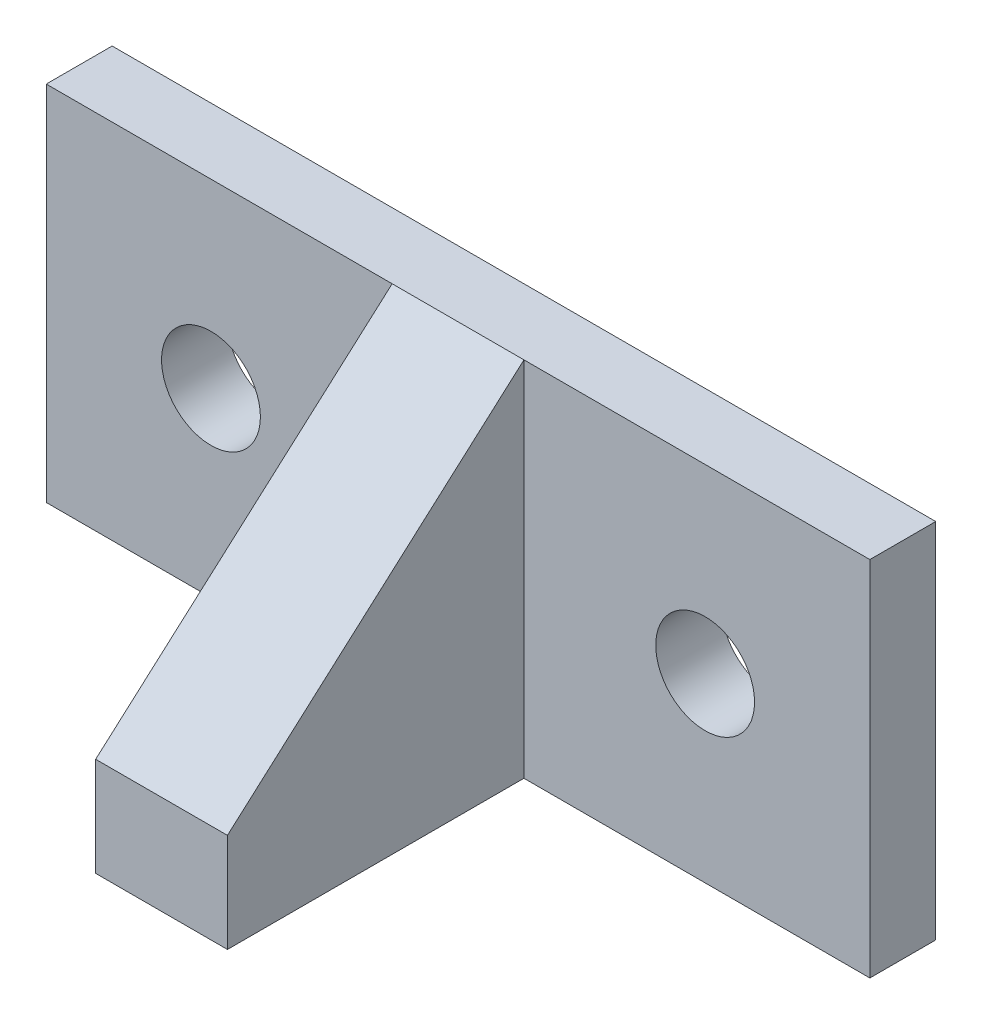
ISO-10303-21;
HEADER;
FILE_DESCRIPTION(('STEP AP214'),'2;1');
FILE_NAME('part.step','',(''),(''),'','','');
FILE_SCHEMA(('AUTOMOTIVE_DESIGN { 1 0 10303 214 1 1 1 1 }'));
ENDSEC;
DATA;
#1=APPLICATION_CONTEXT('core data for automotive mechanical design processes');
#2=APPLICATION_PROTOCOL_DEFINITION('international standard','automotive_design',2000,#1);
#3=PRODUCT_CONTEXT('',#1,'mechanical');
#4=PRODUCT('Part','Part','',(#3));
#5=PRODUCT_RELATED_PRODUCT_CATEGORY('part','',(#4));
#6=PRODUCT_DEFINITION_FORMATION('','',#4);
#7=PRODUCT_DEFINITION_CONTEXT('part definition',#1,'design');
#8=PRODUCT_DEFINITION('design','',#6,#7);
#9=PRODUCT_DEFINITION_SHAPE('','',#8);
#10=(LENGTH_UNIT() NAMED_UNIT(*) SI_UNIT(.MILLI.,.METRE.));
#11=(NAMED_UNIT(*) PLANE_ANGLE_UNIT() SI_UNIT($,.RADIAN.));
#12=(NAMED_UNIT(*) SI_UNIT($,.STERADIAN.) SOLID_ANGLE_UNIT());
#13=UNCERTAINTY_MEASURE_WITH_UNIT(LENGTH_MEASURE(1.E-05),#10,'distance_accuracy_value','');
#14=(GEOMETRIC_REPRESENTATION_CONTEXT(3) GLOBAL_UNCERTAINTY_ASSIGNED_CONTEXT((#13)) GLOBAL_UNIT_ASSIGNED_CONTEXT((#10,
#11,#12)) REPRESENTATION_CONTEXT('',''));
#15=CARTESIAN_POINT('',(0.,0.,0.));
#16=DIRECTION('',(0.,0.,1.));
#17=DIRECTION('',(1.,0.,0.));
#18=AXIS2_PLACEMENT_3D('',#15,#16,#17);
#19=CARTESIAN_POINT('',(-62.5,27.5,10.));
#20=DIRECTION('',(0.,-1.,0.));
#21=DIRECTION('',(0.,0.,-1.));
#22=AXIS2_PLACEMENT_3D('',#19,#20,#21);
#23=PLANE('',#22);
#24=DIRECTION('',(1.,0.,0.));
#25=VECTOR('',#24,1.);
#26=CARTESIAN_POINT('',(-35.,27.5,10.));
#27=LINE('',#26,#25);
#28=CARTESIAN_POINT('',(-10.,27.5,10.));
#29=VERTEX_POINT('',#28);
#30=CARTESIAN_POINT('',(9.99999999999999,27.5,10.));
#31=VERTEX_POINT('',#30);
#32=EDGE_CURVE('E111',#29,#31,#27,.T.);
#33=ORIENTED_EDGE('',*,*,#32,.T.);
#34=DIRECTION('',(-1.,0.,0.));
#35=VECTOR('',#34,1.);
#36=CARTESIAN_POINT('',(-62.5,27.5,10.));
#37=LINE('',#36,#35);
#38=CARTESIAN_POINT('',(62.5,27.5,10.));
#39=VERTEX_POINT('',#38);
#40=EDGE_CURVE('E120',#39,#31,#37,.T.);
#41=ORIENTED_EDGE('',*,*,#40,.F.);
#42=DIRECTION('',(0.,0.,-1.));
#43=VECTOR('',#42,1.);
#44=CARTESIAN_POINT('',(62.5,27.5,10.));
#45=LINE('',#44,#43);
#46=CARTESIAN_POINT('',(62.5,27.5,0.));
#47=VERTEX_POINT('',#46);
#48=EDGE_CURVE('E53',#39,#47,#45,.T.);
#49=ORIENTED_EDGE('',*,*,#48,.T.);
#50=DIRECTION('',(-1.,0.,0.));
#51=VECTOR('',#50,1.);
#52=CARTESIAN_POINT('',(-62.5,27.5,0.));
#53=LINE('',#52,#51);
#54=CARTESIAN_POINT('',(-62.5,27.5,0.));
#55=VERTEX_POINT('',#54);
#56=EDGE_CURVE('E187',#47,#55,#53,.T.);
#57=ORIENTED_EDGE('',*,*,#56,.T.);
#58=DIRECTION('',(0.,0.,-1.));
#59=VECTOR('',#58,1.);
#60=CARTESIAN_POINT('',(-62.5,27.5,10.));
#61=LINE('',#60,#59);
#62=CARTESIAN_POINT('',(-62.5,27.5,10.));
#63=VERTEX_POINT('',#62);
#64=EDGE_CURVE('E202',#63,#55,#61,.T.);
#65=ORIENTED_EDGE('',*,*,#64,.F.);
#66=EDGE_CURVE('E123',#29,#63,#37,.T.);
#67=ORIENTED_EDGE('',*,*,#66,.F.);
#68=EDGE_LOOP('',(#33,#41,#49,#57,#65,#67));
#69=FACE_BOUND('',#68,.T.);
#70=ADVANCED_FACE('F44',(#69),#23,.F.);
#71=CARTESIAN_POINT('',(9.99999999999999,27.5,55.));
#72=DIRECTION('',(-1.,0.,0.));
#73=DIRECTION('',(0.,-1.,0.));
#74=AXIS2_PLACEMENT_3D('',#71,#72,#73);
#75=PLANE('',#74);
#76=DIRECTION('',(0.,-0.66436383882992,0.74740931868366));
#77=VECTOR('',#76,1.);
#78=CARTESIAN_POINT('',(10.,20.3275862068966,18.0689655172414));
#79=LINE('',#78,#77);
#80=CARTESIAN_POINT('',(10.,-12.5,55.));
#81=VERTEX_POINT('',#80);
#82=EDGE_CURVE('E108',#31,#81,#79,.T.);
#83=ORIENTED_EDGE('',*,*,#82,.T.);
#84=DIRECTION('',(0.,1.,0.));
#85=VECTOR('',#84,1.);
#86=CARTESIAN_POINT('',(9.99999999999999,27.5,55.));
#87=LINE('',#86,#85);
#88=CARTESIAN_POINT('',(10.,-27.5,55.));
#89=VERTEX_POINT('',#88);
#90=EDGE_CURVE('E144',#89,#81,#87,.T.);
#91=ORIENTED_EDGE('',*,*,#90,.F.);
#92=DIRECTION('',(0.,0.,-1.));
#93=VECTOR('',#92,1.);
#94=CARTESIAN_POINT('',(10.,-27.5,55.));
#95=LINE('',#94,#93);
#96=CARTESIAN_POINT('',(9.99999999999999,-27.5,10.));
#97=VERTEX_POINT('',#96);
#98=EDGE_CURVE('E137',#89,#97,#95,.T.);
#99=ORIENTED_EDGE('',*,*,#98,.T.);
#100=DIRECTION('',(0.,1.,0.));
#101=VECTOR('',#100,1.);
#102=CARTESIAN_POINT('',(9.99999999999999,27.5,10.));
#103=LINE('',#102,#101);
#104=EDGE_CURVE('E67',#97,#31,#103,.T.);
#105=ORIENTED_EDGE('',*,*,#104,.T.);
#106=EDGE_LOOP('',(#83,#91,#99,#105));
#107=FACE_BOUND('',#106,.T.);
#108=ADVANCED_FACE('F135',(#107),#75,.F.);
#109=CARTESIAN_POINT('',(-10.,27.5,55.));
#110=DIRECTION('',(1.,0.,0.));
#111=DIRECTION('',(0.,1.,0.));
#112=AXIS2_PLACEMENT_3D('',#109,#110,#111);
#113=PLANE('',#112);
#114=DIRECTION('',(0.,-0.66436383882992,0.74740931868366));
#115=VECTOR('',#114,1.);
#116=CARTESIAN_POINT('',(-10.,5.1551724137931,35.1379310344828));
#117=LINE('',#116,#115);
#118=CARTESIAN_POINT('',(-10.,-12.5,55.));
#119=VERTEX_POINT('',#118);
#120=EDGE_CURVE('E60',#29,#119,#117,.T.);
#121=ORIENTED_EDGE('',*,*,#120,.F.);
#122=DIRECTION('',(0.,-1.,0.));
#123=VECTOR('',#122,1.);
#124=CARTESIAN_POINT('',(-10.,27.5,10.));
#125=LINE('',#124,#123);
#126=CARTESIAN_POINT('',(-9.99999999999999,-27.5,10.));
#127=VERTEX_POINT('',#126);
#128=EDGE_CURVE('E139',#29,#127,#125,.T.);
#129=ORIENTED_EDGE('',*,*,#128,.T.);
#130=DIRECTION('',(0.,0.,-1.));
#131=VECTOR('',#130,1.);
#132=CARTESIAN_POINT('',(-9.99999999999999,-27.5,55.));
#133=LINE('',#132,#131);
#134=CARTESIAN_POINT('',(-9.99999999999999,-27.5,55.));
#135=VERTEX_POINT('',#134);
#136=EDGE_CURVE('E153',#135,#127,#133,.T.);
#137=ORIENTED_EDGE('',*,*,#136,.F.);
#138=DIRECTION('',(0.,-1.,0.));
#139=VECTOR('',#138,1.);
#140=CARTESIAN_POINT('',(-10.,27.5,55.));
#141=LINE('',#140,#139);
#142=EDGE_CURVE('E230',#119,#135,#141,.T.);
#143=ORIENTED_EDGE('',*,*,#142,.F.);
#144=EDGE_LOOP('',(#121,#129,#137,#143));
#145=FACE_BOUND('',#144,.T.);
#146=ADVANCED_FACE('F228',(#145),#113,.F.);
#147=CARTESIAN_POINT('',(0.,0.,55.));
#148=DIRECTION('',(0.,0.,1.));
#149=DIRECTION('',(1.,0.,0.));
#150=AXIS2_PLACEMENT_3D('',#147,#148,#149);
#151=PLANE('',#150);
#152=ORIENTED_EDGE('',*,*,#90,.T.);
#153=DIRECTION('',(-1.,0.,0.));
#154=VECTOR('',#153,1.);
#155=CARTESIAN_POINT('',(0.,-12.5,55.));
#156=LINE('',#155,#154);
#157=EDGE_CURVE('E12',#81,#119,#156,.T.);
#158=ORIENTED_EDGE('',*,*,#157,.T.);
#159=ORIENTED_EDGE('',*,*,#142,.T.);
#160=DIRECTION('',(1.,0.,0.));
#161=VECTOR('',#160,1.);
#162=CARTESIAN_POINT('',(-9.99999999999999,-27.5,55.));
#163=LINE('',#162,#161);
#164=EDGE_CURVE('E148',#135,#89,#163,.T.);
#165=ORIENTED_EDGE('',*,*,#164,.T.);
#166=EDGE_LOOP('',(#152,#158,#159,#165));
#167=FACE_BOUND('',#166,.T.);
#168=ADVANCED_FACE('F236',(#167),#151,.T.);
#169=CARTESIAN_POINT('',(0.,0.,10.));
#170=DIRECTION('',(0.,0.,1.));
#171=DIRECTION('',(1.,0.,0.));
#172=AXIS2_PLACEMENT_3D('',#169,#170,#171);
#173=PLANE('',#172);
#174=ORIENTED_EDGE('',*,*,#104,.F.);
#175=DIRECTION('',(1.,0.,0.));
#176=VECTOR('',#175,1.);
#177=CARTESIAN_POINT('',(-62.5,-27.5,10.));
#178=LINE('',#177,#176);
#179=CARTESIAN_POINT('',(62.5,-27.5,10.));
#180=VERTEX_POINT('',#179);
#181=EDGE_CURVE('E179',#97,#180,#178,.T.);
#182=ORIENTED_EDGE('',*,*,#181,.T.);
#183=DIRECTION('',(0.,1.,0.));
#184=VECTOR('',#183,1.);
#185=CARTESIAN_POINT('',(62.5,27.5,10.));
#186=LINE('',#185,#184);
#187=EDGE_CURVE('E129',#180,#39,#186,.T.);
#188=ORIENTED_EDGE('',*,*,#187,.T.);
#189=ORIENTED_EDGE('',*,*,#40,.T.);
#190=EDGE_LOOP('',(#174,#182,#188,#189));
#191=FACE_BOUND('',#190,.T.);
#192=CARTESIAN_POINT('',(37.5,0.,10.));
#193=DIRECTION('',(0.,0.,1.));
#194=DIRECTION('',(1.,0.,0.));
#195=AXIS2_PLACEMENT_3D('',#192,#193,#194);
#196=CIRCLE('',#195,7.5);
#197=CARTESIAN_POINT('',(45.,0.,10.));
#198=VERTEX_POINT('',#197);
#199=EDGE_CURVE('E158',#198,#198,#196,.T.);
#200=ORIENTED_EDGE('',*,*,#199,.F.);
#201=EDGE_LOOP('',(#200));
#202=FACE_BOUND('',#201,.T.);
#203=ADVANCED_FACE('F126',(#191,#202),#173,.T.);
#204=ORIENTED_EDGE('',*,*,#128,.F.);
#205=ORIENTED_EDGE('',*,*,#66,.T.);
#206=DIRECTION('',(0.,-1.,0.));
#207=VECTOR('',#206,1.);
#208=CARTESIAN_POINT('',(-62.5,27.5,10.));
#209=LINE('',#208,#207);
#210=CARTESIAN_POINT('',(-62.5,-27.5,10.));
#211=VERTEX_POINT('',#210);
#212=EDGE_CURVE('E132',#63,#211,#209,.T.);
#213=ORIENTED_EDGE('',*,*,#212,.T.);
#214=EDGE_CURVE('E180',#211,#127,#178,.T.);
#215=ORIENTED_EDGE('',*,*,#214,.T.);
#216=EDGE_LOOP('',(#204,#205,#213,#215));
#217=FACE_BOUND('',#216,.T.);
#218=CARTESIAN_POINT('',(-37.5,0.,10.));
#219=DIRECTION('',(0.,0.,1.));
#220=DIRECTION('',(1.,0.,0.));
#221=AXIS2_PLACEMENT_3D('',#218,#219,#220);
#222=CIRCLE('',#221,7.5);
#223=CARTESIAN_POINT('',(-30.,0.,10.));
#224=VERTEX_POINT('',#223);
#225=EDGE_CURVE('E166',#224,#224,#222,.T.);
#226=ORIENTED_EDGE('',*,*,#225,.F.);
#227=EDGE_LOOP('',(#226));
#228=FACE_BOUND('',#227,.T.);
#229=ADVANCED_FACE('F225',(#217,#228),#173,.T.);
#230=CARTESIAN_POINT('',(0.,0.,0.));
#231=DIRECTION('',(0.,0.,1.));
#232=DIRECTION('',(1.,0.,0.));
#233=AXIS2_PLACEMENT_3D('',#230,#231,#232);
#234=PLANE('',#233);
#235=DIRECTION('',(0.,1.,0.));
#236=VECTOR('',#235,1.);
#237=CARTESIAN_POINT('',(62.5,27.5,0.));
#238=LINE('',#237,#236);
#239=CARTESIAN_POINT('',(62.5,-27.5,0.));
#240=VERTEX_POINT('',#239);
#241=EDGE_CURVE('E170',#240,#47,#238,.T.);
#242=ORIENTED_EDGE('',*,*,#241,.F.);
#243=DIRECTION('',(1.,0.,0.));
#244=VECTOR('',#243,1.);
#245=CARTESIAN_POINT('',(-62.5,-27.5,0.));
#246=LINE('',#245,#244);
#247=CARTESIAN_POINT('',(-62.5,-27.5,0.));
#248=VERTEX_POINT('',#247);
#249=EDGE_CURVE('E175',#248,#240,#246,.T.);
#250=ORIENTED_EDGE('',*,*,#249,.F.);
#251=DIRECTION('',(0.,-1.,0.));
#252=VECTOR('',#251,1.);
#253=CARTESIAN_POINT('',(-62.5,27.5,0.));
#254=LINE('',#253,#252);
#255=EDGE_CURVE('E190',#55,#248,#254,.T.);
#256=ORIENTED_EDGE('',*,*,#255,.F.);
#257=ORIENTED_EDGE('',*,*,#56,.F.);
#258=EDGE_LOOP('',(#242,#250,#256,#257));
#259=FACE_BOUND('',#258,.T.);
#260=CARTESIAN_POINT('',(-37.5,0.,0.));
#261=DIRECTION('',(0.,0.,1.));
#262=DIRECTION('',(1.,0.,0.));
#263=AXIS2_PLACEMENT_3D('',#260,#261,#262);
#264=CIRCLE('',#263,7.5);
#265=CARTESIAN_POINT('',(-30.,0.,0.));
#266=VERTEX_POINT('',#265);
#267=EDGE_CURVE('E162',#266,#266,#264,.T.);
#268=ORIENTED_EDGE('',*,*,#267,.T.);
#269=EDGE_LOOP('',(#268));
#270=FACE_BOUND('',#269,.T.);
#271=CARTESIAN_POINT('',(37.5,0.,0.));
#272=DIRECTION('',(0.,0.,1.));
#273=DIRECTION('',(1.,0.,0.));
#274=AXIS2_PLACEMENT_3D('',#271,#272,#273);
#275=CIRCLE('',#274,7.5);
#276=CARTESIAN_POINT('',(45.,0.,0.));
#277=VERTEX_POINT('',#276);
#278=EDGE_CURVE('E157',#277,#277,#275,.T.);
#279=ORIENTED_EDGE('',*,*,#278,.T.);
#280=EDGE_LOOP('',(#279));
#281=FACE_BOUND('',#280,.T.);
#282=ADVANCED_FACE('F211',(#259,#270,#281),#234,.F.);
#283=CARTESIAN_POINT('',(62.5,27.5,10.));
#284=DIRECTION('',(-1.,0.,0.));
#285=DIRECTION('',(0.,0.,1.));
#286=AXIS2_PLACEMENT_3D('',#283,#284,#285);
#287=PLANE('',#286);
#288=ORIENTED_EDGE('',*,*,#241,.T.);
#289=ORIENTED_EDGE('',*,*,#48,.F.);
#290=ORIENTED_EDGE('',*,*,#187,.F.);
#291=DIRECTION('',(0.,0.,-1.));
#292=VECTOR('',#291,1.);
#293=CARTESIAN_POINT('',(62.5,-27.5,10.));
#294=LINE('',#293,#292);
#295=EDGE_CURVE('E183',#180,#240,#294,.T.);
#296=ORIENTED_EDGE('',*,*,#295,.T.);
#297=EDGE_LOOP('',(#288,#289,#290,#296));
#298=FACE_BOUND('',#297,.T.);
#299=ADVANCED_FACE('F46',(#298),#287,.F.);
#300=CARTESIAN_POINT('',(-62.5,27.5,10.));
#301=DIRECTION('',(1.,0.,0.));
#302=DIRECTION('',(0.,0.,-1.));
#303=AXIS2_PLACEMENT_3D('',#300,#301,#302);
#304=PLANE('',#303);
#305=ORIENTED_EDGE('',*,*,#255,.T.);
#306=DIRECTION('',(0.,0.,-1.));
#307=VECTOR('',#306,1.);
#308=CARTESIAN_POINT('',(-62.5,-27.5,10.));
#309=LINE('',#308,#307);
#310=EDGE_CURVE('E198',#211,#248,#309,.T.);
#311=ORIENTED_EDGE('',*,*,#310,.F.);
#312=ORIENTED_EDGE('',*,*,#212,.F.);
#313=ORIENTED_EDGE('',*,*,#64,.T.);
#314=EDGE_LOOP('',(#305,#311,#312,#313));
#315=FACE_BOUND('',#314,.T.);
#316=ADVANCED_FACE('F216',(#315),#304,.F.);
#317=CARTESIAN_POINT('',(-62.5,-27.5,10.));
#318=DIRECTION('',(0.,1.,0.));
#319=DIRECTION('',(0.,0.,1.));
#320=AXIS2_PLACEMENT_3D('',#317,#318,#319);
#321=PLANE('',#320);
#322=ORIENTED_EDGE('',*,*,#249,.T.);
#323=ORIENTED_EDGE('',*,*,#295,.F.);
#324=ORIENTED_EDGE('',*,*,#181,.F.);
#325=ORIENTED_EDGE('',*,*,#98,.F.);
#326=ORIENTED_EDGE('',*,*,#164,.F.);
#327=ORIENTED_EDGE('',*,*,#136,.T.);
#328=ORIENTED_EDGE('',*,*,#214,.F.);
#329=ORIENTED_EDGE('',*,*,#310,.T.);
#330=EDGE_LOOP('',(#322,#323,#324,#325,#326,#327,#328,#329));
#331=FACE_BOUND('',#330,.T.);
#332=ADVANCED_FACE('F220',(#331),#321,.F.);
#333=CARTESIAN_POINT('',(-37.5,0.,10.));
#334=DIRECTION('',(0.,0.,-1.));
#335=DIRECTION('',(-1.,0.,0.));
#336=AXIS2_PLACEMENT_3D('',#333,#334,#335);
#337=CYLINDRICAL_SURFACE('',#336,7.5);
#338=ORIENTED_EDGE('',*,*,#225,.T.);
#339=EDGE_LOOP('',(#338));
#340=FACE_BOUND('',#339,.T.);
#341=ORIENTED_EDGE('',*,*,#267,.F.);
#342=EDGE_LOOP('',(#341));
#343=FACE_BOUND('',#342,.T.);
#344=ADVANCED_FACE('F258',(#340,#343),#337,.F.);
#345=CARTESIAN_POINT('',(37.5,0.,10.));
#346=DIRECTION('',(0.,0.,-1.));
#347=DIRECTION('',(-1.,0.,0.));
#348=AXIS2_PLACEMENT_3D('',#345,#346,#347);
#349=CYLINDRICAL_SURFACE('',#348,7.5);
#350=ORIENTED_EDGE('',*,*,#199,.T.);
#351=EDGE_LOOP('',(#350));
#352=FACE_BOUND('',#351,.T.);
#353=ORIENTED_EDGE('',*,*,#278,.F.);
#354=EDGE_LOOP('',(#353));
#355=FACE_BOUND('',#354,.T.);
#356=ADVANCED_FACE('F264',(#352,#355),#349,.F.);
#357=CARTESIAN_POINT('',(-35.,20.3275862068965,18.0689655172414));
#358=DIRECTION('',(0.,0.74740931868366,0.66436383882992));
#359=DIRECTION('',(0.,-0.66436383882992,0.74740931868366));
#360=AXIS2_PLACEMENT_3D('',#357,#358,#359);
#361=PLANE('',#360);
#362=ORIENTED_EDGE('',*,*,#120,.T.);
#363=ORIENTED_EDGE('',*,*,#157,.F.);
#364=ORIENTED_EDGE('',*,*,#82,.F.);
#365=ORIENTED_EDGE('',*,*,#32,.F.);
#366=EDGE_LOOP('',(#362,#363,#364,#365));
#367=FACE_BOUND('',#366,.T.);
#368=ADVANCED_FACE('F110',(#367),#361,.T.);
#369=CLOSED_SHELL('',(#70,#108,#146,#168,#203,#229,#282,#299,#316,#332,#344,#356,#368));
#370=MANIFOLD_SOLID_BREP('B2',#369);
#371=ADVANCED_BREP_SHAPE_REPRESENTATION('',(#18,#370),#14);
#372=SHAPE_DEFINITION_REPRESENTATION(#9,#371);
ENDSEC;
END-ISO-10303-21;
